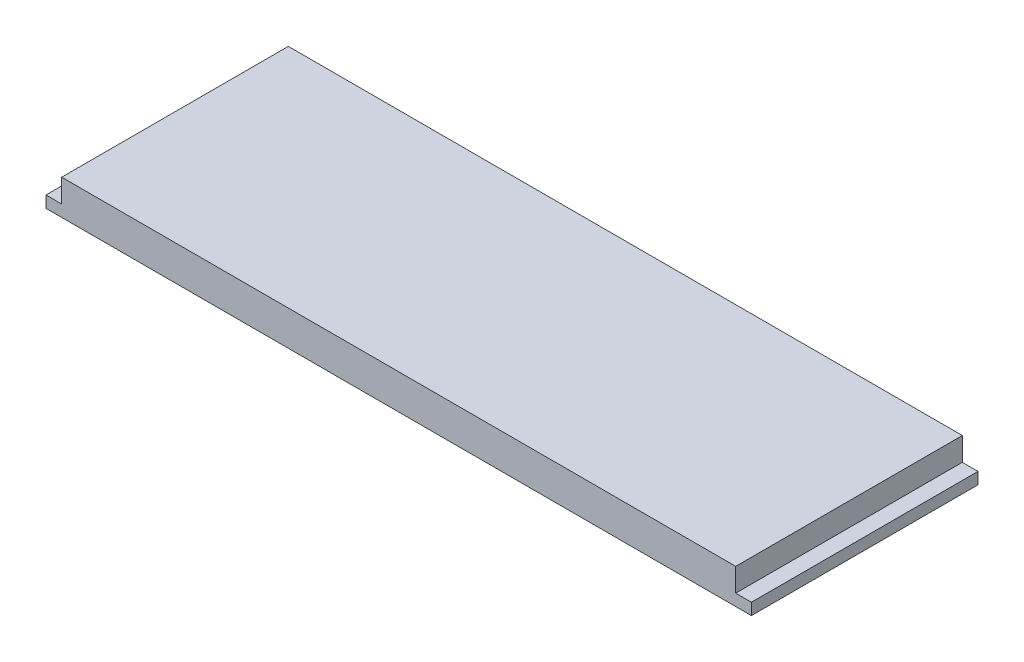
ISO-10303-21;
HEADER;
FILE_DESCRIPTION(('STEP AP214'),'2;1');
FILE_NAME('part.step','',(''),(''),'','','');
FILE_SCHEMA(('AUTOMOTIVE_DESIGN { 1 0 10303 214 1 1 1 1 }'));
ENDSEC;
DATA;
#1=APPLICATION_CONTEXT('core data for automotive mechanical design processes');
#2=APPLICATION_PROTOCOL_DEFINITION('international standard','automotive_design',2000,#1);
#3=PRODUCT_CONTEXT('',#1,'mechanical');
#4=PRODUCT('Part','Part','',(#3));
#5=PRODUCT_RELATED_PRODUCT_CATEGORY('part','',(#4));
#6=PRODUCT_DEFINITION_FORMATION('','',#4);
#7=PRODUCT_DEFINITION_CONTEXT('part definition',#1,'design');
#8=PRODUCT_DEFINITION('design','',#6,#7);
#9=PRODUCT_DEFINITION_SHAPE('','',#8);
#10=(LENGTH_UNIT() NAMED_UNIT(*) SI_UNIT(.MILLI.,.METRE.));
#11=(NAMED_UNIT(*) PLANE_ANGLE_UNIT() SI_UNIT($,.RADIAN.));
#12=(NAMED_UNIT(*) SI_UNIT($,.STERADIAN.) SOLID_ANGLE_UNIT());
#13=UNCERTAINTY_MEASURE_WITH_UNIT(LENGTH_MEASURE(1.E-05),#10,'distance_accuracy_value','');
#14=(GEOMETRIC_REPRESENTATION_CONTEXT(3) GLOBAL_UNCERTAINTY_ASSIGNED_CONTEXT((#13)) GLOBAL_UNIT_ASSIGNED_CONTEXT((#10,
#11,#12)) REPRESENTATION_CONTEXT('',''));
#15=CARTESIAN_POINT('',(0.,0.,0.));
#16=DIRECTION('',(0.,0.,1.));
#17=DIRECTION('',(1.,0.,0.));
#18=AXIS2_PLACEMENT_3D('',#15,#16,#17);
#19=CARTESIAN_POINT('',(0.,1.,0.));
#20=DIRECTION('',(0.,1.,0.));
#21=DIRECTION('',(0.,0.,1.));
#22=AXIS2_PLACEMENT_3D('',#19,#20,#21);
#23=PLANE('',#22);
#24=DIRECTION('',(0.,0.,1.));
#25=VECTOR('',#24,1.);
#26=CARTESIAN_POINT('',(1.35,1.,0.));
#27=LINE('',#26,#25);
#28=CARTESIAN_POINT('',(1.35,1.,0.));
#29=VERTEX_POINT('',#28);
#30=CARTESIAN_POINT('',(1.35,1.,19.5));
#31=VERTEX_POINT('',#30);
#32=EDGE_CURVE('E61',#29,#31,#27,.T.);
#33=ORIENTED_EDGE('',*,*,#32,.F.);
#34=DIRECTION('',(-1.,0.,0.));
#35=VECTOR('',#34,1.);
#36=CARTESIAN_POINT('',(0.,1.,0.));
#37=LINE('',#36,#35);
#38=CARTESIAN_POINT('',(0.,1.,0.));
#39=VERTEX_POINT('',#38);
#40=EDGE_CURVE('E158',#29,#39,#37,.T.);
#41=ORIENTED_EDGE('',*,*,#40,.T.);
#42=DIRECTION('',(0.,0.,1.));
#43=VECTOR('',#42,1.);
#44=CARTESIAN_POINT('',(0.,1.,0.));
#45=LINE('',#44,#43);
#46=CARTESIAN_POINT('',(0.,1.,19.5));
#47=VERTEX_POINT('',#46);
#48=EDGE_CURVE('E146',#39,#47,#45,.T.);
#49=ORIENTED_EDGE('',*,*,#48,.T.);
#50=DIRECTION('',(1.,0.,0.));
#51=VECTOR('',#50,1.);
#52=CARTESIAN_POINT('',(0.,1.,19.5));
#53=LINE('',#52,#51);
#54=EDGE_CURVE('E152',#47,#31,#53,.T.);
#55=ORIENTED_EDGE('',*,*,#54,.T.);
#56=EDGE_LOOP('',(#33,#41,#49,#55));
#57=FACE_BOUND('',#56,.T.);
#58=ADVANCED_FACE('F45',(#57),#23,.T.);
#59=CARTESIAN_POINT('',(0.,1.,0.));
#60=DIRECTION('',(1.,0.,0.));
#61=DIRECTION('',(0.,0.,-1.));
#62=AXIS2_PLACEMENT_3D('',#59,#60,#61);
#63=PLANE('',#62);
#64=DIRECTION('',(0.,0.,1.));
#65=VECTOR('',#64,1.);
#66=CARTESIAN_POINT('',(0.,0.,0.));
#67=LINE('',#66,#65);
#68=CARTESIAN_POINT('',(0.,0.,0.));
#69=VERTEX_POINT('',#68);
#70=CARTESIAN_POINT('',(0.,0.,19.5));
#71=VERTEX_POINT('',#70);
#72=EDGE_CURVE('E135',#69,#71,#67,.T.);
#73=ORIENTED_EDGE('',*,*,#72,.T.);
#74=DIRECTION('',(0.,-1.,0.));
#75=VECTOR('',#74,1.);
#76=CARTESIAN_POINT('',(0.,1.,19.5));
#77=LINE('',#76,#75);
#78=EDGE_CURVE('E11',#47,#71,#77,.T.);
#79=ORIENTED_EDGE('',*,*,#78,.F.);
#80=ORIENTED_EDGE('',*,*,#48,.F.);
#81=DIRECTION('',(0.,-1.,0.));
#82=VECTOR('',#81,1.);
#83=CARTESIAN_POINT('',(0.,1.,0.));
#84=LINE('',#83,#82);
#85=EDGE_CURVE('E161',#39,#69,#84,.T.);
#86=ORIENTED_EDGE('',*,*,#85,.T.);
#87=EDGE_LOOP('',(#73,#79,#80,#86));
#88=FACE_BOUND('',#87,.T.);
#89=ADVANCED_FACE('F47',(#88),#63,.F.);
#90=CARTESIAN_POINT('',(0.,1.,19.5));
#91=DIRECTION('',(0.,0.,-1.));
#92=DIRECTION('',(-1.,0.,0.));
#93=AXIS2_PLACEMENT_3D('',#90,#91,#92);
#94=PLANE('',#93);
#95=DIRECTION('',(1.,0.,0.));
#96=VECTOR('',#95,1.);
#97=CARTESIAN_POINT('',(0.,0.,19.5));
#98=LINE('',#97,#96);
#99=CARTESIAN_POINT('',(60.7,0.,19.5));
#100=VERTEX_POINT('',#99);
#101=EDGE_CURVE('E140',#71,#100,#98,.T.);
#102=ORIENTED_EDGE('',*,*,#101,.T.);
#103=DIRECTION('',(0.,-1.,0.));
#104=VECTOR('',#103,1.);
#105=CARTESIAN_POINT('',(60.7,1.,19.5));
#106=LINE('',#105,#104);
#107=CARTESIAN_POINT('',(60.7,1.,19.5));
#108=VERTEX_POINT('',#107);
#109=EDGE_CURVE('E54',#108,#100,#106,.T.);
#110=ORIENTED_EDGE('',*,*,#109,.F.);
#111=CARTESIAN_POINT('',(59.35,1.,19.5));
#112=VERTEX_POINT('',#111);
#113=EDGE_CURVE('E150',#112,#108,#53,.T.);
#114=ORIENTED_EDGE('',*,*,#113,.F.);
#115=DIRECTION('',(0.,-1.,0.));
#116=VECTOR('',#115,1.);
#117=CARTESIAN_POINT('',(59.35,3.,19.5));
#118=LINE('',#117,#116);
#119=CARTESIAN_POINT('',(59.35,3.,19.5));
#120=VERTEX_POINT('',#119);
#121=EDGE_CURVE('E117',#120,#112,#118,.T.);
#122=ORIENTED_EDGE('',*,*,#121,.F.);
#123=DIRECTION('',(1.,0.,0.));
#124=VECTOR('',#123,1.);
#125=CARTESIAN_POINT('',(1.35,3.,19.5));
#126=LINE('',#125,#124);
#127=CARTESIAN_POINT('',(1.35,3.,19.5));
#128=VERTEX_POINT('',#127);
#129=EDGE_CURVE('E111',#128,#120,#126,.T.);
#130=ORIENTED_EDGE('',*,*,#129,.F.);
#131=DIRECTION('',(0.,-1.,0.));
#132=VECTOR('',#131,1.);
#133=CARTESIAN_POINT('',(1.35,3.,19.5));
#134=LINE('',#133,#132);
#135=EDGE_CURVE('E115',#128,#31,#134,.T.);
#136=ORIENTED_EDGE('',*,*,#135,.T.);
#137=ORIENTED_EDGE('',*,*,#54,.F.);
#138=ORIENTED_EDGE('',*,*,#78,.T.);
#139=EDGE_LOOP('',(#102,#110,#114,#122,#130,#136,#137,#138));
#140=FACE_BOUND('',#139,.T.);
#141=ADVANCED_FACE('F113',(#140),#94,.F.);
#142=CARTESIAN_POINT('',(60.7,1.,0.));
#143=DIRECTION('',(-1.,0.,0.));
#144=DIRECTION('',(0.,0.,1.));
#145=AXIS2_PLACEMENT_3D('',#142,#143,#144);
#146=PLANE('',#145);
#147=DIRECTION('',(0.,0.,-1.));
#148=VECTOR('',#147,1.);
#149=CARTESIAN_POINT('',(60.7,0.,0.));
#150=LINE('',#149,#148);
#151=CARTESIAN_POINT('',(60.7,0.,0.));
#152=VERTEX_POINT('',#151);
#153=EDGE_CURVE('E165',#100,#152,#150,.T.);
#154=ORIENTED_EDGE('',*,*,#153,.T.);
#155=DIRECTION('',(0.,-1.,0.));
#156=VECTOR('',#155,1.);
#157=CARTESIAN_POINT('',(60.7,1.,0.));
#158=LINE('',#157,#156);
#159=CARTESIAN_POINT('',(60.7,1.,0.));
#160=VERTEX_POINT('',#159);
#161=EDGE_CURVE('E173',#160,#152,#158,.T.);
#162=ORIENTED_EDGE('',*,*,#161,.F.);
#163=DIRECTION('',(0.,0.,-1.));
#164=VECTOR('',#163,1.);
#165=CARTESIAN_POINT('',(60.7,1.,0.));
#166=LINE('',#165,#164);
#167=EDGE_CURVE('E155',#108,#160,#166,.T.);
#168=ORIENTED_EDGE('',*,*,#167,.F.);
#169=ORIENTED_EDGE('',*,*,#109,.T.);
#170=EDGE_LOOP('',(#154,#162,#168,#169));
#171=FACE_BOUND('',#170,.T.);
#172=ADVANCED_FACE('F182',(#171),#146,.F.);
#173=CARTESIAN_POINT('',(0.,1.,0.));
#174=DIRECTION('',(0.,0.,1.));
#175=DIRECTION('',(1.,0.,0.));
#176=AXIS2_PLACEMENT_3D('',#173,#174,#175);
#177=PLANE('',#176);
#178=DIRECTION('',(-1.,0.,0.));
#179=VECTOR('',#178,1.);
#180=CARTESIAN_POINT('',(0.,0.,0.));
#181=LINE('',#180,#179);
#182=EDGE_CURVE('E151',#152,#69,#181,.T.);
#183=ORIENTED_EDGE('',*,*,#182,.T.);
#184=ORIENTED_EDGE('',*,*,#85,.F.);
#185=ORIENTED_EDGE('',*,*,#40,.F.);
#186=DIRECTION('',(0.,-1.,0.));
#187=VECTOR('',#186,1.);
#188=CARTESIAN_POINT('',(1.35,3.,0.));
#189=LINE('',#188,#187);
#190=CARTESIAN_POINT('',(1.35,3.,0.));
#191=VERTEX_POINT('',#190);
#192=EDGE_CURVE('E205',#191,#29,#189,.T.);
#193=ORIENTED_EDGE('',*,*,#192,.F.);
#194=DIRECTION('',(-1.,0.,0.));
#195=VECTOR('',#194,1.);
#196=CARTESIAN_POINT('',(1.35,3.,0.));
#197=LINE('',#196,#195);
#198=CARTESIAN_POINT('',(59.35,3.,0.));
#199=VERTEX_POINT('',#198);
#200=EDGE_CURVE('E127',#199,#191,#197,.T.);
#201=ORIENTED_EDGE('',*,*,#200,.F.);
#202=DIRECTION('',(0.,-1.,0.));
#203=VECTOR('',#202,1.);
#204=CARTESIAN_POINT('',(59.35,3.,0.));
#205=LINE('',#204,#203);
#206=CARTESIAN_POINT('',(59.35,1.,0.));
#207=VERTEX_POINT('',#206);
#208=EDGE_CURVE('E142',#199,#207,#205,.T.);
#209=ORIENTED_EDGE('',*,*,#208,.T.);
#210=EDGE_CURVE('E159',#160,#207,#37,.T.);
#211=ORIENTED_EDGE('',*,*,#210,.F.);
#212=ORIENTED_EDGE('',*,*,#161,.T.);
#213=EDGE_LOOP('',(#183,#184,#185,#193,#201,#209,#211,#212));
#214=FACE_BOUND('',#213,.T.);
#215=ADVANCED_FACE('F190',(#214),#177,.F.);
#216=DIRECTION('',(0.,0.,-1.));
#217=VECTOR('',#216,1.);
#218=CARTESIAN_POINT('',(59.35,1.,0.));
#219=LINE('',#218,#217);
#220=EDGE_CURVE('E69',#112,#207,#219,.T.);
#221=ORIENTED_EDGE('',*,*,#220,.F.);
#222=ORIENTED_EDGE('',*,*,#113,.T.);
#223=ORIENTED_EDGE('',*,*,#167,.T.);
#224=ORIENTED_EDGE('',*,*,#210,.T.);
#225=EDGE_LOOP('',(#221,#222,#223,#224));
#226=FACE_BOUND('',#225,.T.);
#227=ADVANCED_FACE('F197',(#226),#23,.T.);
#228=CARTESIAN_POINT('',(0.,0.,0.));
#229=DIRECTION('',(0.,1.,0.));
#230=DIRECTION('',(0.,0.,1.));
#231=AXIS2_PLACEMENT_3D('',#228,#229,#230);
#232=PLANE('',#231);
#233=ORIENTED_EDGE('',*,*,#72,.F.);
#234=ORIENTED_EDGE('',*,*,#182,.F.);
#235=ORIENTED_EDGE('',*,*,#153,.F.);
#236=ORIENTED_EDGE('',*,*,#101,.F.);
#237=EDGE_LOOP('',(#233,#234,#235,#236));
#238=FACE_BOUND('',#237,.T.);
#239=ADVANCED_FACE('F187',(#238),#232,.F.);
#240=CARTESIAN_POINT('',(1.35,3.,0.));
#241=DIRECTION('',(1.,0.,0.));
#242=DIRECTION('',(0.,0.,-1.));
#243=AXIS2_PLACEMENT_3D('',#240,#241,#242);
#244=PLANE('',#243);
#245=ORIENTED_EDGE('',*,*,#32,.T.);
#246=ORIENTED_EDGE('',*,*,#135,.F.);
#247=DIRECTION('',(0.,0.,1.));
#248=VECTOR('',#247,1.);
#249=CARTESIAN_POINT('',(1.35,3.,0.));
#250=LINE('',#249,#248);
#251=EDGE_CURVE('E122',#191,#128,#250,.T.);
#252=ORIENTED_EDGE('',*,*,#251,.F.);
#253=ORIENTED_EDGE('',*,*,#192,.T.);
#254=EDGE_LOOP('',(#245,#246,#252,#253));
#255=FACE_BOUND('',#254,.T.);
#256=ADVANCED_FACE('F133',(#255),#244,.F.);
#257=CARTESIAN_POINT('',(59.35,3.,0.));
#258=DIRECTION('',(-1.,0.,0.));
#259=DIRECTION('',(0.,0.,1.));
#260=AXIS2_PLACEMENT_3D('',#257,#258,#259);
#261=PLANE('',#260);
#262=ORIENTED_EDGE('',*,*,#220,.T.);
#263=ORIENTED_EDGE('',*,*,#208,.F.);
#264=DIRECTION('',(0.,0.,-1.));
#265=VECTOR('',#264,1.);
#266=CARTESIAN_POINT('',(59.35,3.,0.));
#267=LINE('',#266,#265);
#268=EDGE_CURVE('E121',#120,#199,#267,.T.);
#269=ORIENTED_EDGE('',*,*,#268,.F.);
#270=ORIENTED_EDGE('',*,*,#121,.T.);
#271=EDGE_LOOP('',(#262,#263,#269,#270));
#272=FACE_BOUND('',#271,.T.);
#273=ADVANCED_FACE('F199',(#272),#261,.F.);
#274=CARTESIAN_POINT('',(0.,3.,0.));
#275=DIRECTION('',(0.,1.,0.));
#276=DIRECTION('',(0.,0.,1.));
#277=AXIS2_PLACEMENT_3D('',#274,#275,#276);
#278=PLANE('',#277);
#279=ORIENTED_EDGE('',*,*,#251,.T.);
#280=ORIENTED_EDGE('',*,*,#129,.T.);
#281=ORIENTED_EDGE('',*,*,#268,.T.);
#282=ORIENTED_EDGE('',*,*,#200,.T.);
#283=EDGE_LOOP('',(#279,#280,#281,#282));
#284=FACE_BOUND('',#283,.T.);
#285=ADVANCED_FACE('F125',(#284),#278,.T.);
#286=CLOSED_SHELL('',(#58,#89,#141,#172,#215,#227,#239,#256,#273,#285));
#287=MANIFOLD_SOLID_BREP('B2',#286);
#288=ADVANCED_BREP_SHAPE_REPRESENTATION('',(#18,#287),#14);
#289=SHAPE_DEFINITION_REPRESENTATION(#9,#288);
ENDSEC;
END-ISO-10303-21;
